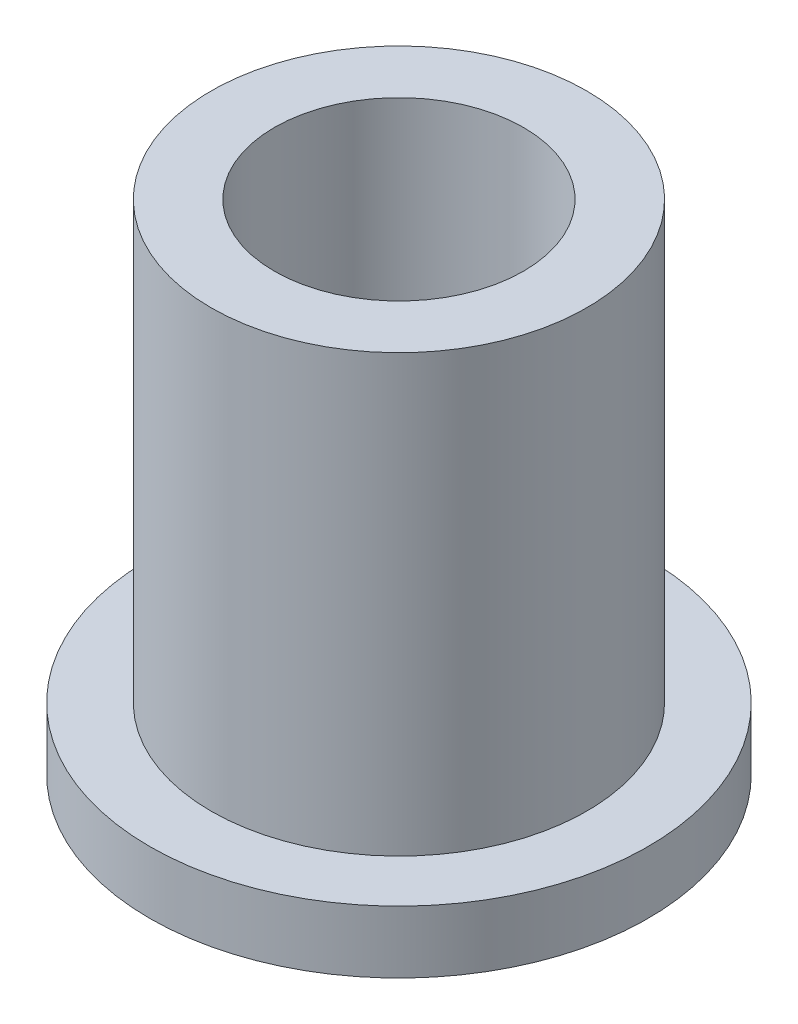
ISO-10303-21;
HEADER;
FILE_DESCRIPTION(('STEP AP214'),'2;1');
FILE_NAME('part.step','',(''),(''),'','','');
FILE_SCHEMA(('AUTOMOTIVE_DESIGN { 1 0 10303 214 1 1 1 1 }'));
ENDSEC;
DATA;
#1=APPLICATION_CONTEXT('core data for automotive mechanical design processes');
#2=APPLICATION_PROTOCOL_DEFINITION('international standard','automotive_design',2000,#1);
#3=PRODUCT_CONTEXT('',#1,'mechanical');
#4=PRODUCT('Part','Part','',(#3));
#5=PRODUCT_RELATED_PRODUCT_CATEGORY('part','',(#4));
#6=PRODUCT_DEFINITION_FORMATION('','',#4);
#7=PRODUCT_DEFINITION_CONTEXT('part definition',#1,'design');
#8=PRODUCT_DEFINITION('design','',#6,#7);
#9=PRODUCT_DEFINITION_SHAPE('','',#8);
#10=(LENGTH_UNIT() NAMED_UNIT(*) SI_UNIT(.MILLI.,.METRE.));
#11=(NAMED_UNIT(*) PLANE_ANGLE_UNIT() SI_UNIT($,.RADIAN.));
#12=(NAMED_UNIT(*) SI_UNIT($,.STERADIAN.) SOLID_ANGLE_UNIT());
#13=UNCERTAINTY_MEASURE_WITH_UNIT(LENGTH_MEASURE(1.E-05),#10,'distance_accuracy_value','');
#14=(GEOMETRIC_REPRESENTATION_CONTEXT(3) GLOBAL_UNCERTAINTY_ASSIGNED_CONTEXT((#13)) GLOBAL_UNIT_ASSIGNED_CONTEXT((#10,
#11,#12)) REPRESENTATION_CONTEXT('',''));
#15=CARTESIAN_POINT('',(0.,0.,0.));
#16=DIRECTION('',(0.,0.,1.));
#17=DIRECTION('',(1.,0.,0.));
#18=AXIS2_PLACEMENT_3D('',#15,#16,#17);
#19=CARTESIAN_POINT('',(0.,12.7,0.));
#20=DIRECTION('',(0.,1.,0.));
#21=DIRECTION('',(0.,0.,1.));
#22=AXIS2_PLACEMENT_3D('',#19,#20,#21);
#23=PLANE('',#22);
#24=CARTESIAN_POINT('',(0.,12.7,0.));
#25=DIRECTION('',(0.,1.,0.));
#26=DIRECTION('',(0.,0.,1.));
#27=AXIS2_PLACEMENT_3D('',#24,#25,#26);
#28=CIRCLE('',#27,4.7879);
#29=CARTESIAN_POINT('',(0.,12.7,4.7879));
#30=VERTEX_POINT('',#29);
#31=EDGE_CURVE('E10',#30,#30,#28,.T.);
#32=ORIENTED_EDGE('',*,*,#31,.T.);
#33=EDGE_LOOP('',(#32));
#34=FACE_BOUND('',#33,.T.);
#35=CARTESIAN_POINT('',(0.,12.7,0.));
#36=DIRECTION('',(0.,1.,0.));
#37=DIRECTION('',(0.,0.,1.));
#38=AXIS2_PLACEMENT_3D('',#35,#36,#37);
#39=CIRCLE('',#38,3.175);
#40=CARTESIAN_POINT('',(0.,12.7,3.175));
#41=VERTEX_POINT('',#40);
#42=EDGE_CURVE('E53',#41,#41,#39,.T.);
#43=ORIENTED_EDGE('',*,*,#42,.F.);
#44=EDGE_LOOP('',(#43));
#45=FACE_BOUND('',#44,.T.);
#46=ADVANCED_FACE('F45',(#34,#45),#23,.T.);
#47=CARTESIAN_POINT('',(0.,0.,0.));
#48=DIRECTION('',(0.,1.,0.));
#49=DIRECTION('',(0.,0.,1.));
#50=AXIS2_PLACEMENT_3D('',#47,#48,#49);
#51=PLANE('',#50);
#52=CARTESIAN_POINT('',(0.,0.,0.));
#53=DIRECTION('',(0.,1.,0.));
#54=DIRECTION('',(0.,0.,1.));
#55=AXIS2_PLACEMENT_3D('',#52,#53,#54);
#56=CIRCLE('',#55,3.175);
#57=CARTESIAN_POINT('',(0.,0.,3.175));
#58=VERTEX_POINT('',#57);
#59=EDGE_CURVE('E59',#58,#58,#56,.T.);
#60=ORIENTED_EDGE('',*,*,#59,.T.);
#61=EDGE_LOOP('',(#60));
#62=FACE_BOUND('',#61,.T.);
#63=CARTESIAN_POINT('',(0.,0.,0.));
#64=DIRECTION('',(0.,1.,0.));
#65=DIRECTION('',(0.,0.,1.));
#66=AXIS2_PLACEMENT_3D('',#63,#64,#65);
#67=CIRCLE('',#66,6.35);
#68=CARTESIAN_POINT('',(0.,0.,6.35));
#69=VERTEX_POINT('',#68);
#70=EDGE_CURVE('E68',#69,#69,#67,.T.);
#71=ORIENTED_EDGE('',*,*,#70,.F.);
#72=EDGE_LOOP('',(#71));
#73=FACE_BOUND('',#72,.T.);
#74=ADVANCED_FACE('F97',(#62,#73),#51,.F.);
#75=CARTESIAN_POINT('',(0.,12.7,0.));
#76=DIRECTION('',(0.,-1.,0.));
#77=DIRECTION('',(0.,0.,-1.));
#78=AXIS2_PLACEMENT_3D('',#75,#76,#77);
#79=CYLINDRICAL_SURFACE('',#78,4.7879);
#80=CARTESIAN_POINT('',(0.,1.5875,0.));
#81=DIRECTION('',(0.,1.,0.));
#82=DIRECTION('',(0.,0.,1.));
#83=AXIS2_PLACEMENT_3D('',#80,#81,#82);
#84=CIRCLE('',#83,4.7879);
#85=CARTESIAN_POINT('',(0.,1.5875,4.7879));
#86=VERTEX_POINT('',#85);
#87=EDGE_CURVE('E72',#86,#86,#84,.T.);
#88=ORIENTED_EDGE('',*,*,#87,.T.);
#89=EDGE_LOOP('',(#88));
#90=FACE_BOUND('',#89,.T.);
#91=ORIENTED_EDGE('',*,*,#31,.F.);
#92=EDGE_LOOP('',(#91));
#93=FACE_BOUND('',#92,.T.);
#94=ADVANCED_FACE('F47',(#90,#93),#79,.T.);
#95=CARTESIAN_POINT('',(0.,12.7,0.));
#96=DIRECTION('',(0.,-1.,0.));
#97=DIRECTION('',(0.,0.,-1.));
#98=AXIS2_PLACEMENT_3D('',#95,#96,#97);
#99=CYLINDRICAL_SURFACE('',#98,3.175);
#100=ORIENTED_EDGE('',*,*,#42,.T.);
#101=EDGE_LOOP('',(#100));
#102=FACE_BOUND('',#101,.T.);
#103=ORIENTED_EDGE('',*,*,#59,.F.);
#104=EDGE_LOOP('',(#103));
#105=FACE_BOUND('',#104,.T.);
#106=ADVANCED_FACE('F86',(#102,#105),#99,.F.);
#107=CARTESIAN_POINT('',(0.,1.5875,0.));
#108=DIRECTION('',(0.,1.,0.));
#109=DIRECTION('',(0.,0.,1.));
#110=AXIS2_PLACEMENT_3D('',#107,#108,#109);
#111=PLANE('',#110);
#112=CARTESIAN_POINT('',(0.,1.5875,0.));
#113=DIRECTION('',(0.,1.,0.));
#114=DIRECTION('',(0.,0.,1.));
#115=AXIS2_PLACEMENT_3D('',#112,#113,#114);
#116=CIRCLE('',#115,6.35);
#117=CARTESIAN_POINT('',(0.,1.5875,6.35));
#118=VERTEX_POINT('',#117);
#119=EDGE_CURVE('E66',#118,#118,#116,.T.);
#120=ORIENTED_EDGE('',*,*,#119,.T.);
#121=EDGE_LOOP('',(#120));
#122=FACE_BOUND('',#121,.T.);
#123=ORIENTED_EDGE('',*,*,#87,.F.);
#124=EDGE_LOOP('',(#123));
#125=FACE_BOUND('',#124,.T.);
#126=ADVANCED_FACE('F83',(#122,#125),#111,.T.);
#127=CARTESIAN_POINT('',(0.,1.5875,0.));
#128=DIRECTION('',(0.,-1.,0.));
#129=DIRECTION('',(0.,0.,-1.));
#130=AXIS2_PLACEMENT_3D('',#127,#128,#129);
#131=CYLINDRICAL_SURFACE('',#130,6.35);
#132=ORIENTED_EDGE('',*,*,#119,.F.);
#133=EDGE_LOOP('',(#132));
#134=FACE_BOUND('',#133,.T.);
#135=ORIENTED_EDGE('',*,*,#70,.T.);
#136=EDGE_LOOP('',(#135));
#137=FACE_BOUND('',#136,.T.);
#138=ADVANCED_FACE('F85',(#134,#137),#131,.T.);
#139=CLOSED_SHELL('',(#46,#74,#94,#106,#126,#138));
#140=MANIFOLD_SOLID_BREP('B2',#139);
#141=ADVANCED_BREP_SHAPE_REPRESENTATION('',(#18,#140),#14);
#142=SHAPE_DEFINITION_REPRESENTATION(#9,#141);
ENDSEC;
END-ISO-10303-21;
